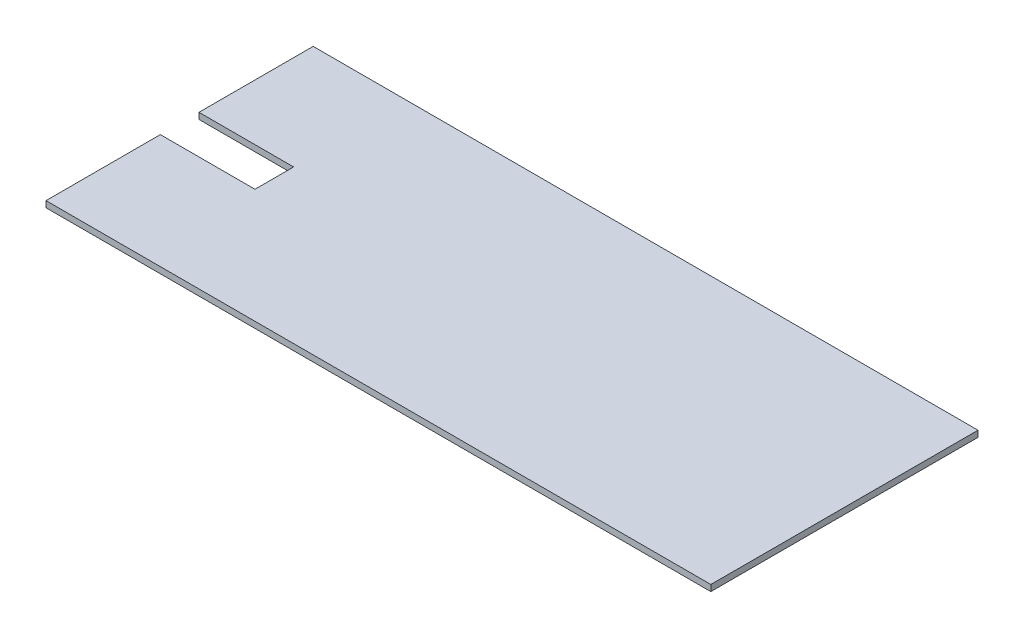
ISO-10303-21;
HEADER;
FILE_DESCRIPTION(('STEP AP214'),'2;1');
FILE_NAME('part.step','',(''),(''),'','','');
FILE_SCHEMA(('AUTOMOTIVE_DESIGN { 1 0 10303 214 1 1 1 1 }'));
ENDSEC;
DATA;
#1=APPLICATION_CONTEXT('core data for automotive mechanical design processes');
#2=APPLICATION_PROTOCOL_DEFINITION('international standard','automotive_design',2000,#1);
#3=PRODUCT_CONTEXT('',#1,'mechanical');
#4=PRODUCT('Part','Part','',(#3));
#5=PRODUCT_RELATED_PRODUCT_CATEGORY('part','',(#4));
#6=PRODUCT_DEFINITION_FORMATION('','',#4);
#7=PRODUCT_DEFINITION_CONTEXT('part definition',#1,'design');
#8=PRODUCT_DEFINITION('design','',#6,#7);
#9=PRODUCT_DEFINITION_SHAPE('','',#8);
#10=(LENGTH_UNIT() NAMED_UNIT(*) SI_UNIT(.MILLI.,.METRE.));
#11=(NAMED_UNIT(*) PLANE_ANGLE_UNIT() SI_UNIT($,.RADIAN.));
#12=(NAMED_UNIT(*) SI_UNIT($,.STERADIAN.) SOLID_ANGLE_UNIT());
#13=UNCERTAINTY_MEASURE_WITH_UNIT(LENGTH_MEASURE(1.E-05),#10,'distance_accuracy_value','');
#14=(GEOMETRIC_REPRESENTATION_CONTEXT(3) GLOBAL_UNCERTAINTY_ASSIGNED_CONTEXT((#13)) GLOBAL_UNIT_ASSIGNED_CONTEXT((#10,
#11,#12)) REPRESENTATION_CONTEXT('',''));
#15=CARTESIAN_POINT('',(0.,0.,0.));
#16=DIRECTION('',(0.,0.,1.));
#17=DIRECTION('',(1.,0.,0.));
#18=AXIS2_PLACEMENT_3D('',#15,#16,#17);
#19=CARTESIAN_POINT('',(1.,2.,-2.98470480305224));
#20=DIRECTION('',(1.,0.,0.));
#21=DIRECTION('',(0.,0.,-1.));
#22=AXIS2_PLACEMENT_3D('',#19,#20,#21);
#23=PLANE('',#22);
#24=DIRECTION('',(0.,0.,1.));
#25=VECTOR('',#24,1.);
#26=CARTESIAN_POINT('',(1.,0.,-2.98470480305224));
#27=LINE('',#26,#25);
#28=CARTESIAN_POINT('',(1.,0.,-2.98470480305224));
#29=VERTEX_POINT('',#28);
#30=CARTESIAN_POINT('',(1.00000000000001,0.,33.7762594894242));
#31=VERTEX_POINT('',#30);
#32=EDGE_CURVE('E127',#29,#31,#27,.T.);
#33=ORIENTED_EDGE('',*,*,#32,.T.);
#34=DIRECTION('',(0.,-1.,0.));
#35=VECTOR('',#34,1.);
#36=CARTESIAN_POINT('',(1.00000000000001,2.,33.7762594894242));
#37=LINE('',#36,#35);
#38=CARTESIAN_POINT('',(1.00000000000001,2.,33.7762594894242));
#39=VERTEX_POINT('',#38);
#40=EDGE_CURVE('E11',#39,#31,#37,.T.);
#41=ORIENTED_EDGE('',*,*,#40,.F.);
#42=DIRECTION('',(0.,0.,1.));
#43=VECTOR('',#42,1.);
#44=CARTESIAN_POINT('',(1.,2.,-2.98470480305224));
#45=LINE('',#44,#43);
#46=CARTESIAN_POINT('',(1.,2.,-2.98470480305224));
#47=VERTEX_POINT('',#46);
#48=EDGE_CURVE('E141',#47,#39,#45,.T.);
#49=ORIENTED_EDGE('',*,*,#48,.F.);
#50=DIRECTION('',(0.,-1.,0.));
#51=VECTOR('',#50,1.);
#52=CARTESIAN_POINT('',(1.,2.,-2.98470480305224));
#53=LINE('',#52,#51);
#54=EDGE_CURVE('E123',#47,#29,#53,.T.);
#55=ORIENTED_EDGE('',*,*,#54,.T.);
#56=EDGE_LOOP('',(#33,#41,#49,#55));
#57=FACE_BOUND('',#56,.T.);
#58=ADVANCED_FACE('F31',(#57),#23,.F.);
#59=CARTESIAN_POINT('',(1.00000000000001,2.,33.7762594894242));
#60=DIRECTION('',(0.,0.,-1.));
#61=DIRECTION('',(-1.,0.,0.));
#62=AXIS2_PLACEMENT_3D('',#59,#60,#61);
#63=PLANE('',#62);
#64=DIRECTION('',(1.,0.,0.));
#65=VECTOR('',#64,1.);
#66=CARTESIAN_POINT('',(1.00000000000001,0.,33.7762594894242));
#67=LINE('',#66,#65);
#68=CARTESIAN_POINT('',(31.4666343632591,0.,33.7762594894242));
#69=VERTEX_POINT('',#68);
#70=EDGE_CURVE('E130',#31,#69,#67,.T.);
#71=ORIENTED_EDGE('',*,*,#70,.T.);
#72=DIRECTION('',(0.,-1.,0.));
#73=VECTOR('',#72,1.);
#74=CARTESIAN_POINT('',(31.4666343632591,2.,33.7762594894242));
#75=LINE('',#74,#73);
#76=CARTESIAN_POINT('',(31.4666343632591,2.,33.7762594894242));
#77=VERTEX_POINT('',#76);
#78=EDGE_CURVE('E39',#77,#69,#75,.T.);
#79=ORIENTED_EDGE('',*,*,#78,.F.);
#80=DIRECTION('',(1.,0.,0.));
#81=VECTOR('',#80,1.);
#82=CARTESIAN_POINT('',(1.00000000000001,2.,33.7762594894242));
#83=LINE('',#82,#81);
#84=EDGE_CURVE('E90',#39,#77,#83,.T.);
#85=ORIENTED_EDGE('',*,*,#84,.F.);
#86=ORIENTED_EDGE('',*,*,#40,.T.);
#87=EDGE_LOOP('',(#71,#79,#85,#86));
#88=FACE_BOUND('',#87,.T.);
#89=ADVANCED_FACE('F176',(#88),#63,.F.);
#90=CARTESIAN_POINT('',(31.4666343632591,2.,33.7762594894242));
#91=DIRECTION('',(1.,0.,0.));
#92=DIRECTION('',(0.,0.,-1.));
#93=AXIS2_PLACEMENT_3D('',#90,#91,#92);
#94=PLANE('',#93);
#95=DIRECTION('',(0.,0.,1.));
#96=VECTOR('',#95,1.);
#97=CARTESIAN_POINT('',(31.4666343632591,0.,33.7762594894242));
#98=LINE('',#97,#96);
#99=CARTESIAN_POINT('',(31.4666343632591,0.,46.2128701391215));
#100=VERTEX_POINT('',#99);
#101=EDGE_CURVE('E132',#69,#100,#98,.T.);
#102=ORIENTED_EDGE('',*,*,#101,.T.);
#103=DIRECTION('',(0.,-1.,0.));
#104=VECTOR('',#103,1.);
#105=CARTESIAN_POINT('',(31.4666343632591,2.,46.2128701391215));
#106=LINE('',#105,#104);
#107=CARTESIAN_POINT('',(31.4666343632591,2.,46.2128701391215));
#108=VERTEX_POINT('',#107);
#109=EDGE_CURVE('E148',#108,#100,#106,.T.);
#110=ORIENTED_EDGE('',*,*,#109,.F.);
#111=DIRECTION('',(0.,0.,1.));
#112=VECTOR('',#111,1.);
#113=CARTESIAN_POINT('',(31.4666343632591,2.,33.7762594894242));
#114=LINE('',#113,#112);
#115=EDGE_CURVE('E156',#77,#108,#114,.T.);
#116=ORIENTED_EDGE('',*,*,#115,.F.);
#117=ORIENTED_EDGE('',*,*,#78,.T.);
#118=EDGE_LOOP('',(#102,#110,#116,#117));
#119=FACE_BOUND('',#118,.T.);
#120=ADVANCED_FACE('F154',(#119),#94,.F.);
#121=CARTESIAN_POINT('',(31.4666343632591,2.,46.2128701391215));
#122=DIRECTION('',(0.,0.,1.));
#123=DIRECTION('',(1.,0.,0.));
#124=AXIS2_PLACEMENT_3D('',#121,#122,#123);
#125=PLANE('',#124);
#126=DIRECTION('',(-1.,0.,0.));
#127=VECTOR('',#126,1.);
#128=CARTESIAN_POINT('',(31.4666343632591,0.,46.2128701391215));
#129=LINE('',#128,#127);
#130=CARTESIAN_POINT('',(1.00000000000001,0.,46.2128701391215));
#131=VERTEX_POINT('',#130);
#132=EDGE_CURVE('E134',#100,#131,#129,.T.);
#133=ORIENTED_EDGE('',*,*,#132,.T.);
#134=DIRECTION('',(0.,-1.,0.));
#135=VECTOR('',#134,1.);
#136=CARTESIAN_POINT('',(1.00000000000001,2.,46.2128701391215));
#137=LINE('',#136,#135);
#138=CARTESIAN_POINT('',(1.00000000000001,2.,46.2128701391215));
#139=VERTEX_POINT('',#138);
#140=EDGE_CURVE('E145',#139,#131,#137,.T.);
#141=ORIENTED_EDGE('',*,*,#140,.F.);
#142=DIRECTION('',(-1.,0.,0.));
#143=VECTOR('',#142,1.);
#144=CARTESIAN_POINT('',(31.4666343632591,2.,46.2128701391215));
#145=LINE('',#144,#143);
#146=EDGE_CURVE('E168',#108,#139,#145,.T.);
#147=ORIENTED_EDGE('',*,*,#146,.F.);
#148=ORIENTED_EDGE('',*,*,#109,.T.);
#149=EDGE_LOOP('',(#133,#141,#147,#148));
#150=FACE_BOUND('',#149,.T.);
#151=ADVANCED_FACE('F164',(#150),#125,.F.);
#152=CARTESIAN_POINT('',(1.00000000000001,2.,46.2128701391215));
#153=DIRECTION('',(1.,0.,0.));
#154=DIRECTION('',(0.,0.,-1.));
#155=AXIS2_PLACEMENT_3D('',#152,#153,#154);
#156=PLANE('',#155);
#157=DIRECTION('',(0.,0.,1.));
#158=VECTOR('',#157,1.);
#159=CARTESIAN_POINT('',(1.00000000000001,0.,46.2128701391215));
#160=LINE('',#159,#158);
#161=CARTESIAN_POINT('',(1.00000000000001,0.,83.0152951969477));
#162=VERTEX_POINT('',#161);
#163=EDGE_CURVE('E136',#131,#162,#160,.T.);
#164=ORIENTED_EDGE('',*,*,#163,.T.);
#165=DIRECTION('',(0.,-1.,0.));
#166=VECTOR('',#165,1.);
#167=CARTESIAN_POINT('',(1.00000000000001,2.,83.0152951969477));
#168=LINE('',#167,#166);
#169=CARTESIAN_POINT('',(1.00000000000001,2.,83.0152951969477));
#170=VERTEX_POINT('',#169);
#171=EDGE_CURVE('E118',#170,#162,#168,.T.);
#172=ORIENTED_EDGE('',*,*,#171,.F.);
#173=DIRECTION('',(0.,0.,1.));
#174=VECTOR('',#173,1.);
#175=CARTESIAN_POINT('',(1.00000000000001,2.,46.2128701391215));
#176=LINE('',#175,#174);
#177=EDGE_CURVE('E109',#139,#170,#176,.T.);
#178=ORIENTED_EDGE('',*,*,#177,.F.);
#179=ORIENTED_EDGE('',*,*,#140,.T.);
#180=EDGE_LOOP('',(#164,#172,#178,#179));
#181=FACE_BOUND('',#180,.T.);
#182=ADVANCED_FACE('F167',(#181),#156,.F.);
#183=CARTESIAN_POINT('',(1.00000000000001,2.,83.0152951969477));
#184=DIRECTION('',(0.,0.,-1.));
#185=DIRECTION('',(-1.,0.,0.));
#186=AXIS2_PLACEMENT_3D('',#183,#184,#185);
#187=PLANE('',#186);
#188=DIRECTION('',(1.,0.,0.));
#189=VECTOR('',#188,1.);
#190=CARTESIAN_POINT('',(1.00000000000001,0.,83.0152951969477));
#191=LINE('',#190,#189);
#192=CARTESIAN_POINT('',(215.,0.,83.0152951969477));
#193=VERTEX_POINT('',#192);
#194=EDGE_CURVE('E117',#162,#193,#191,.T.);
#195=ORIENTED_EDGE('',*,*,#194,.T.);
#196=DIRECTION('',(0.,-1.,0.));
#197=VECTOR('',#196,1.);
#198=CARTESIAN_POINT('',(215.,2.,83.0152951969477));
#199=LINE('',#198,#197);
#200=CARTESIAN_POINT('',(215.,2.,83.0152951969477));
#201=VERTEX_POINT('',#200);
#202=EDGE_CURVE('E114',#201,#193,#199,.T.);
#203=ORIENTED_EDGE('',*,*,#202,.F.);
#204=DIRECTION('',(1.,0.,0.));
#205=VECTOR('',#204,1.);
#206=CARTESIAN_POINT('',(1.00000000000001,2.,83.0152951969477));
#207=LINE('',#206,#205);
#208=EDGE_CURVE('E103',#170,#201,#207,.T.);
#209=ORIENTED_EDGE('',*,*,#208,.F.);
#210=ORIENTED_EDGE('',*,*,#171,.T.);
#211=EDGE_LOOP('',(#195,#203,#209,#210));
#212=FACE_BOUND('',#211,.T.);
#213=ADVANCED_FACE('F115',(#212),#187,.F.);
#214=CARTESIAN_POINT('',(215.,2.,-2.98470480305224));
#215=DIRECTION('',(-1.,0.,0.));
#216=DIRECTION('',(0.,0.,1.));
#217=AXIS2_PLACEMENT_3D('',#214,#215,#216);
#218=PLANE('',#217);
#219=DIRECTION('',(0.,0.,-1.));
#220=VECTOR('',#219,1.);
#221=CARTESIAN_POINT('',(215.,0.,-2.98470480305224));
#222=LINE('',#221,#220);
#223=CARTESIAN_POINT('',(215.,0.,-2.98470480305224));
#224=VERTEX_POINT('',#223);
#225=EDGE_CURVE('E76',#193,#224,#222,.T.);
#226=ORIENTED_EDGE('',*,*,#225,.T.);
#227=DIRECTION('',(0.,-1.,0.));
#228=VECTOR('',#227,1.);
#229=CARTESIAN_POINT('',(215.,2.,-2.98470480305224));
#230=LINE('',#229,#228);
#231=CARTESIAN_POINT('',(215.,2.,-2.98470480305224));
#232=VERTEX_POINT('',#231);
#233=EDGE_CURVE('E119',#232,#224,#230,.T.);
#234=ORIENTED_EDGE('',*,*,#233,.F.);
#235=DIRECTION('',(0.,0.,-1.));
#236=VECTOR('',#235,1.);
#237=CARTESIAN_POINT('',(215.,2.,-2.98470480305224));
#238=LINE('',#237,#236);
#239=EDGE_CURVE('E107',#201,#232,#238,.T.);
#240=ORIENTED_EDGE('',*,*,#239,.F.);
#241=ORIENTED_EDGE('',*,*,#202,.T.);
#242=EDGE_LOOP('',(#226,#234,#240,#241));
#243=FACE_BOUND('',#242,.T.);
#244=ADVANCED_FACE('F121',(#243),#218,.F.);
#245=CARTESIAN_POINT('',(1.,2.,-2.98470480305224));
#246=DIRECTION('',(0.,0.,1.));
#247=DIRECTION('',(1.,0.,0.));
#248=AXIS2_PLACEMENT_3D('',#245,#246,#247);
#249=PLANE('',#248);
#250=DIRECTION('',(-1.,0.,0.));
#251=VECTOR('',#250,1.);
#252=CARTESIAN_POINT('',(1.,0.,-2.98470480305224));
#253=LINE('',#252,#251);
#254=EDGE_CURVE('E82',#224,#29,#253,.T.);
#255=ORIENTED_EDGE('',*,*,#254,.T.);
#256=ORIENTED_EDGE('',*,*,#54,.F.);
#257=DIRECTION('',(-1.,0.,0.));
#258=VECTOR('',#257,1.);
#259=CARTESIAN_POINT('',(1.,2.,-2.98470480305224));
#260=LINE('',#259,#258);
#261=EDGE_CURVE('E47',#232,#47,#260,.T.);
#262=ORIENTED_EDGE('',*,*,#261,.F.);
#263=ORIENTED_EDGE('',*,*,#233,.T.);
#264=EDGE_LOOP('',(#255,#256,#262,#263));
#265=FACE_BOUND('',#264,.T.);
#266=ADVANCED_FACE('F192',(#265),#249,.F.);
#267=CARTESIAN_POINT('',(1.00000000000001,2.,33.7762594894242));
#268=DIRECTION('',(0.,1.,0.));
#269=DIRECTION('',(0.,0.,1.));
#270=AXIS2_PLACEMENT_3D('',#267,#268,#269);
#271=PLANE('',#270);
#272=ORIENTED_EDGE('',*,*,#48,.T.);
#273=ORIENTED_EDGE('',*,*,#84,.T.);
#274=ORIENTED_EDGE('',*,*,#115,.T.);
#275=ORIENTED_EDGE('',*,*,#146,.T.);
#276=ORIENTED_EDGE('',*,*,#177,.T.);
#277=ORIENTED_EDGE('',*,*,#208,.T.);
#278=ORIENTED_EDGE('',*,*,#239,.T.);
#279=ORIENTED_EDGE('',*,*,#261,.T.);
#280=EDGE_LOOP('',(#272,#273,#274,#275,#276,#277,#278,#279));
#281=FACE_BOUND('',#280,.T.);
#282=ADVANCED_FACE('F105',(#281),#271,.T.);
#283=CARTESIAN_POINT('',(1.00000000000001,0.,33.7762594894242));
#284=DIRECTION('',(0.,1.,0.));
#285=DIRECTION('',(0.,0.,1.));
#286=AXIS2_PLACEMENT_3D('',#283,#284,#285);
#287=PLANE('',#286);
#288=ORIENTED_EDGE('',*,*,#32,.F.);
#289=ORIENTED_EDGE('',*,*,#254,.F.);
#290=ORIENTED_EDGE('',*,*,#225,.F.);
#291=ORIENTED_EDGE('',*,*,#194,.F.);
#292=ORIENTED_EDGE('',*,*,#163,.F.);
#293=ORIENTED_EDGE('',*,*,#132,.F.);
#294=ORIENTED_EDGE('',*,*,#101,.F.);
#295=ORIENTED_EDGE('',*,*,#70,.F.);
#296=EDGE_LOOP('',(#288,#289,#290,#291,#292,#293,#294,#295));
#297=FACE_BOUND('',#296,.T.);
#298=ADVANCED_FACE('F160',(#297),#287,.F.);
#299=CLOSED_SHELL('',(#58,#89,#120,#151,#182,#213,#244,#266,#282,#298));
#300=MANIFOLD_SOLID_BREP('B2',#299);
#301=ADVANCED_BREP_SHAPE_REPRESENTATION('',(#18,#300),#14);
#302=SHAPE_DEFINITION_REPRESENTATION(#9,#301);
ENDSEC;
END-ISO-10303-21;
